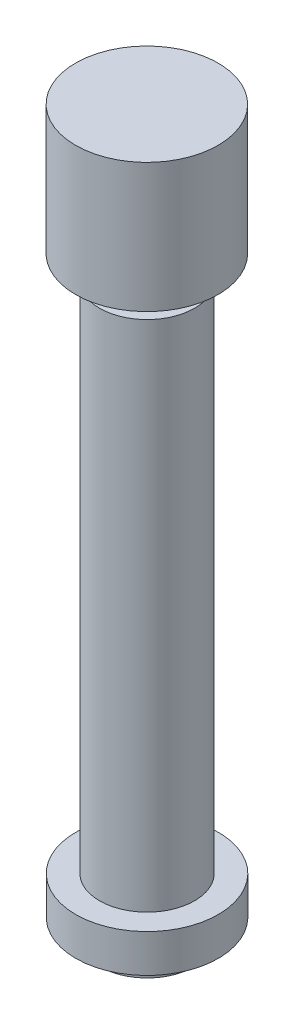
ISO-10303-21;
HEADER;
FILE_DESCRIPTION(('STEP AP214'),'2;1');
FILE_NAME('part.step','',(''),(''),'','','');
FILE_SCHEMA(('AUTOMOTIVE_DESIGN { 1 0 10303 214 1 1 1 1 }'));
ENDSEC;
DATA;
#1=APPLICATION_CONTEXT('core data for automotive mechanical design processes');
#2=APPLICATION_PROTOCOL_DEFINITION('international standard','automotive_design',2000,#1);
#3=PRODUCT_CONTEXT('',#1,'mechanical');
#4=PRODUCT('Part','Part','',(#3));
#5=PRODUCT_RELATED_PRODUCT_CATEGORY('part','',(#4));
#6=PRODUCT_DEFINITION_FORMATION('','',#4);
#7=PRODUCT_DEFINITION_CONTEXT('part definition',#1,'design');
#8=PRODUCT_DEFINITION('design','',#6,#7);
#9=PRODUCT_DEFINITION_SHAPE('','',#8);
#10=(LENGTH_UNIT() NAMED_UNIT(*) SI_UNIT(.MILLI.,.METRE.));
#11=(NAMED_UNIT(*) PLANE_ANGLE_UNIT() SI_UNIT($,.RADIAN.));
#12=(NAMED_UNIT(*) SI_UNIT($,.STERADIAN.) SOLID_ANGLE_UNIT());
#13=UNCERTAINTY_MEASURE_WITH_UNIT(LENGTH_MEASURE(1.E-05),#10,'distance_accuracy_value','');
#14=(GEOMETRIC_REPRESENTATION_CONTEXT(3) GLOBAL_UNCERTAINTY_ASSIGNED_CONTEXT((#13)) GLOBAL_UNIT_ASSIGNED_CONTEXT((#10,
#11,#12)) REPRESENTATION_CONTEXT('',''));
#15=CARTESIAN_POINT('',(0.,0.,0.));
#16=DIRECTION('',(0.,0.,1.));
#17=DIRECTION('',(1.,0.,0.));
#18=AXIS2_PLACEMENT_3D('',#15,#16,#17);
#19=CARTESIAN_POINT('',(0.,62.5,0.));
#20=DIRECTION('',(0.,1.,0.));
#21=DIRECTION('',(0.,0.,1.));
#22=AXIS2_PLACEMENT_3D('',#19,#20,#21);
#23=PLANE('',#22);
#24=CARTESIAN_POINT('',(-0.00278180327484279,62.5,0.0173397285152532));
#25=DIRECTION('',(0.,1.,0.));
#26=DIRECTION('',(0.,0.,1.));
#27=AXIS2_PLACEMENT_3D('',#24,#25,#26);
#28=CIRCLE('',#27,7.5);
#29=CARTESIAN_POINT('',(-0.00278180327484279,62.5,7.51733972851525));
#30=VERTEX_POINT('',#29);
#31=EDGE_CURVE('E47',#30,#30,#28,.T.);
#32=ORIENTED_EDGE('',*,*,#31,.F.);
#33=EDGE_LOOP('',(#32));
#34=FACE_BOUND('',#33,.T.);
#35=ADVANCED_FACE('F41',(#34),#23,.F.);
#36=CARTESIAN_POINT('',(0.,76.1,0.));
#37=DIRECTION('',(0.,1.,0.));
#38=DIRECTION('',(0.,0.,1.));
#39=AXIS2_PLACEMENT_3D('',#36,#37,#38);
#40=PLANE('',#39);
#41=CARTESIAN_POINT('',(-0.00278180327484279,76.1,0.0173397285152532));
#42=DIRECTION('',(0.,1.,0.));
#43=DIRECTION('',(0.,0.,1.));
#44=AXIS2_PLACEMENT_3D('',#41,#42,#43);
#45=CIRCLE('',#44,7.5);
#46=CARTESIAN_POINT('',(-0.00278180327484279,76.1,7.51733972851525));
#47=VERTEX_POINT('',#46);
#48=EDGE_CURVE('E12',#47,#47,#45,.T.);
#49=ORIENTED_EDGE('',*,*,#48,.T.);
#50=EDGE_LOOP('',(#49));
#51=FACE_BOUND('',#50,.T.);
#52=ADVANCED_FACE('F57',(#51),#40,.T.);
#53=CARTESIAN_POINT('',(-0.00278180327484279,62.5,0.0173397285152532));
#54=DIRECTION('',(0.,1.,0.));
#55=DIRECTION('',(0.,0.,1.));
#56=AXIS2_PLACEMENT_3D('',#53,#54,#55);
#57=CYLINDRICAL_SURFACE('',#56,7.5);
#58=ORIENTED_EDGE('',*,*,#31,.T.);
#59=EDGE_LOOP('',(#58));
#60=FACE_BOUND('',#59,.T.);
#61=ORIENTED_EDGE('',*,*,#48,.F.);
#62=EDGE_LOOP('',(#61));
#63=FACE_BOUND('',#62,.T.);
#64=ADVANCED_FACE('F53',(#60,#63),#57,.T.);
#65=CLOSED_SHELL('',(#35,#52,#64));
#66=MANIFOLD_SOLID_BREP('B2',#65);
#67=CARTESIAN_POINT('',(0.,2.,0.));
#68=DIRECTION('',(0.,-1.,0.));
#69=DIRECTION('',(0.,0.,-1.));
#70=AXIS2_PLACEMENT_3D('',#67,#68,#69);
#71=CYLINDRICAL_SURFACE('',#70,5.);
#72=CARTESIAN_POINT('',(0.,2.,0.));
#73=DIRECTION('',(0.,1.,0.));
#74=DIRECTION('',(0.,0.,1.));
#75=AXIS2_PLACEMENT_3D('',#72,#73,#74);
#76=CIRCLE('',#75,5.);
#77=CARTESIAN_POINT('',(0.,2.,5.));
#78=VERTEX_POINT('',#77);
#79=EDGE_CURVE('E89',#78,#78,#76,.T.);
#80=ORIENTED_EDGE('',*,*,#79,.F.);
#81=EDGE_LOOP('',(#80));
#82=FACE_BOUND('',#81,.T.);
#83=CARTESIAN_POINT('',(0.,0.,0.));
#84=DIRECTION('',(0.,1.,0.));
#85=DIRECTION('',(0.,0.,1.));
#86=AXIS2_PLACEMENT_3D('',#83,#84,#85);
#87=CIRCLE('',#86,5.);
#88=CARTESIAN_POINT('',(0.,0.,5.));
#89=VERTEX_POINT('',#88);
#90=EDGE_CURVE('E85',#89,#89,#87,.T.);
#91=ORIENTED_EDGE('',*,*,#90,.T.);
#92=EDGE_LOOP('',(#91));
#93=FACE_BOUND('',#92,.T.);
#94=ADVANCED_FACE('F82',(#82,#93),#71,.T.);
#95=CARTESIAN_POINT('',(0.,0.,0.));
#96=DIRECTION('',(0.,1.,0.));
#97=DIRECTION('',(0.,0.,1.));
#98=AXIS2_PLACEMENT_3D('',#95,#96,#97);
#99=PLANE('',#98);
#100=ORIENTED_EDGE('',*,*,#90,.F.);
#101=EDGE_LOOP('',(#100));
#102=FACE_BOUND('',#101,.T.);
#103=ADVANCED_FACE('F108',(#102),#99,.F.);
#104=CARTESIAN_POINT('',(0.,2.,0.));
#105=DIRECTION('',(0.,1.,0.));
#106=DIRECTION('',(0.,0.,1.));
#107=AXIS2_PLACEMENT_3D('',#104,#105,#106);
#108=PLANE('',#107);
#109=ORIENTED_EDGE('',*,*,#79,.T.);
#110=EDGE_LOOP('',(#109));
#111=FACE_BOUND('',#110,.T.);
#112=CARTESIAN_POINT('',(0.,2.,0.));
#113=DIRECTION('',(0.,1.,0.));
#114=DIRECTION('',(0.,0.,1.));
#115=AXIS2_PLACEMENT_3D('',#112,#113,#114);
#116=CIRCLE('',#115,7.5);
#117=CARTESIAN_POINT('',(0.,2.,7.5));
#118=VERTEX_POINT('',#117);
#119=EDGE_CURVE('E97',#118,#118,#116,.T.);
#120=ORIENTED_EDGE('',*,*,#119,.F.);
#121=EDGE_LOOP('',(#120));
#122=FACE_BOUND('',#121,.T.);
#123=ADVANCED_FACE('F110',(#111,#122),#108,.F.);
#124=CARTESIAN_POINT('',(0.,6.,0.));
#125=DIRECTION('',(0.,1.,0.));
#126=DIRECTION('',(0.,0.,1.));
#127=AXIS2_PLACEMENT_3D('',#124,#125,#126);
#128=PLANE('',#127);
#129=CARTESIAN_POINT('',(0.,6.,0.));
#130=DIRECTION('',(0.,1.,0.));
#131=DIRECTION('',(0.,0.,1.));
#132=AXIS2_PLACEMENT_3D('',#129,#130,#131);
#133=CIRCLE('',#132,5.);
#134=CARTESIAN_POINT('',(0.,6.,5.));
#135=VERTEX_POINT('',#134);
#136=EDGE_CURVE('E40',#135,#135,#133,.T.);
#137=ORIENTED_EDGE('',*,*,#136,.F.);
#138=EDGE_LOOP('',(#137));
#139=FACE_BOUND('',#138,.T.);
#140=CARTESIAN_POINT('',(0.,6.,0.));
#141=DIRECTION('',(0.,1.,0.));
#142=DIRECTION('',(0.,0.,1.));
#143=AXIS2_PLACEMENT_3D('',#140,#141,#142);
#144=CIRCLE('',#143,7.5);
#145=CARTESIAN_POINT('',(0.,6.,7.5));
#146=VERTEX_POINT('',#145);
#147=EDGE_CURVE('E100',#146,#146,#144,.T.);
#148=ORIENTED_EDGE('',*,*,#147,.T.);
#149=EDGE_LOOP('',(#148));
#150=FACE_BOUND('',#149,.T.);
#151=ADVANCED_FACE('F116',(#139,#150),#128,.T.);
#152=CARTESIAN_POINT('',(0.,2.,0.));
#153=DIRECTION('',(0.,1.,0.));
#154=DIRECTION('',(0.,0.,1.));
#155=AXIS2_PLACEMENT_3D('',#152,#153,#154);
#156=CYLINDRICAL_SURFACE('',#155,7.5);
#157=ORIENTED_EDGE('',*,*,#119,.T.);
#158=EDGE_LOOP('',(#157));
#159=FACE_BOUND('',#158,.T.);
#160=ORIENTED_EDGE('',*,*,#147,.F.);
#161=EDGE_LOOP('',(#160));
#162=FACE_BOUND('',#161,.T.);
#163=ADVANCED_FACE('F111',(#159,#162),#156,.T.);
#164=CARTESIAN_POINT('',(0.,60.,0.));
#165=DIRECTION('',(0.,-1.,0.));
#166=DIRECTION('',(0.,0.,-1.));
#167=AXIS2_PLACEMENT_3D('',#164,#165,#166);
#168=CYLINDRICAL_SURFACE('',#167,5.);
#169=CARTESIAN_POINT('',(0.,60.,0.));
#170=DIRECTION('',(0.,1.,0.));
#171=DIRECTION('',(0.,0.,1.));
#172=AXIS2_PLACEMENT_3D('',#169,#170,#171);
#173=CIRCLE('',#172,5.);
#174=CARTESIAN_POINT('',(0.,60.,5.));
#175=VERTEX_POINT('',#174);
#176=EDGE_CURVE('E96',#175,#175,#173,.T.);
#177=ORIENTED_EDGE('',*,*,#176,.F.);
#178=EDGE_LOOP('',(#177));
#179=FACE_BOUND('',#178,.T.);
#180=ORIENTED_EDGE('',*,*,#136,.T.);
#181=EDGE_LOOP('',(#180));
#182=FACE_BOUND('',#181,.T.);
#183=ADVANCED_FACE('F119',(#179,#182),#168,.T.);
#184=CARTESIAN_POINT('',(0.,60.,0.));
#185=DIRECTION('',(0.,1.,0.));
#186=DIRECTION('',(0.,0.,1.));
#187=AXIS2_PLACEMENT_3D('',#184,#185,#186);
#188=PLANE('',#187);
#189=ORIENTED_EDGE('',*,*,#176,.T.);
#190=EDGE_LOOP('',(#189));
#191=FACE_BOUND('',#190,.T.);
#192=ADVANCED_FACE('F128',(#191),#188,.T.);
#193=CLOSED_SHELL('',(#94,#103,#123,#151,#163,#183,#192));
#194=MANIFOLD_SOLID_BREP('B7',#193);
#195=ADVANCED_BREP_SHAPE_REPRESENTATION('',(#18,#66,#194),#14);
#196=SHAPE_DEFINITION_REPRESENTATION(#9,#195);
ENDSEC;
END-ISO-10303-21;
